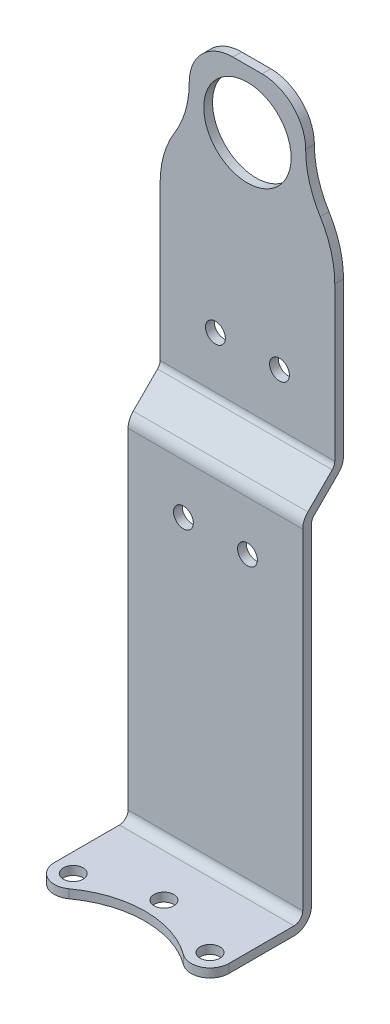
ISO-10303-21;
HEADER;
FILE_DESCRIPTION(('STEP AP214'),'2;1');
FILE_NAME('part.step','',(''),(''),'','','');
FILE_SCHEMA(('AUTOMOTIVE_DESIGN { 1 0 10303 214 1 1 1 1 }'));
ENDSEC;
DATA;
#1=APPLICATION_CONTEXT('core data for automotive mechanical design processes');
#2=APPLICATION_PROTOCOL_DEFINITION('international standard','automotive_design',2000,#1);
#3=PRODUCT_CONTEXT('',#1,'mechanical');
#4=PRODUCT('Part','Part','',(#3));
#5=PRODUCT_RELATED_PRODUCT_CATEGORY('part','',(#4));
#6=PRODUCT_DEFINITION_FORMATION('','',#4);
#7=PRODUCT_DEFINITION_CONTEXT('part definition',#1,'design');
#8=PRODUCT_DEFINITION('design','',#6,#7);
#9=PRODUCT_DEFINITION_SHAPE('','',#8);
#10=(LENGTH_UNIT() NAMED_UNIT(*) SI_UNIT(.MILLI.,.METRE.));
#11=(NAMED_UNIT(*) PLANE_ANGLE_UNIT() SI_UNIT($,.RADIAN.));
#12=(NAMED_UNIT(*) SI_UNIT($,.STERADIAN.) SOLID_ANGLE_UNIT());
#13=UNCERTAINTY_MEASURE_WITH_UNIT(LENGTH_MEASURE(1.E-05),#10,'distance_accuracy_value','');
#14=(GEOMETRIC_REPRESENTATION_CONTEXT(3) GLOBAL_UNCERTAINTY_ASSIGNED_CONTEXT((#13)) GLOBAL_UNIT_ASSIGNED_CONTEXT((#10,
#11,#12)) REPRESENTATION_CONTEXT('',''));
#15=CARTESIAN_POINT('',(0.,0.,0.));
#16=DIRECTION('',(0.,0.,1.));
#17=DIRECTION('',(1.,0.,0.));
#18=AXIS2_PLACEMENT_3D('',#15,#16,#17);
#19=CARTESIAN_POINT('',(-15.,-33.4999999999987,-4.));
#20=DIRECTION('',(-1.,0.,0.));
#21=DIRECTION('',(0.,0.,1.));
#22=AXIS2_PLACEMENT_3D('',#19,#20,#21);
#23=PLANE('',#22);
#24=DIRECTION('',(0.,1.,0.));
#25=VECTOR('',#24,1.);
#26=CARTESIAN_POINT('',(-15.,-33.4999999999987,-4.));
#27=LINE('',#26,#25);
#28=CARTESIAN_POINT('',(-15.,33.621320343561,-4.));
#29=VERTEX_POINT('',#28);
#30=CARTESIAN_POINT('',(-15.0000000000001,60.0000000000013,-4.));
#31=VERTEX_POINT('',#30);
#32=EDGE_CURVE('E315',#29,#31,#27,.T.);
#33=ORIENTED_EDGE('',*,*,#32,.F.);
#34=CARTESIAN_POINT('',(-15.,33.621320343561,-1.));
#35=DIRECTION('',(-1.,0.,0.));
#36=DIRECTION('',(0.,0.,1.));
#37=AXIS2_PLACEMENT_3D('',#34,#35,#36);
#38=CIRCLE('',#37,3.);
#39=CARTESIAN_POINT('',(-15.,31.5000000000013,-3.12132034355966));
#40=VERTEX_POINT('',#39);
#41=EDGE_CURVE('E414',#29,#40,#38,.T.);
#42=ORIENTED_EDGE('',*,*,#41,.T.);
#43=DIRECTION('',(0.,0.707106781186551,-0.707106781186544));
#44=VECTOR('',#43,1.);
#45=CARTESIAN_POINT('',(-15.,26.8786796564416,1.5));
#46=LINE('',#45,#44);
#47=CARTESIAN_POINT('',(-15.,27.3180194846618,1.06066017177983));
#48=VERTEX_POINT('',#47);
#49=EDGE_CURVE('E478',#48,#40,#46,.T.);
#50=ORIENTED_EDGE('',*,*,#49,.F.);
#51=CARTESIAN_POINT('',(-15.,26.257359312882,0.));
#52=DIRECTION('',(-1.,0.,0.));
#53=DIRECTION('',(0.,0.,1.));
#54=AXIS2_PLACEMENT_3D('',#51,#52,#53);
#55=CIRCLE('',#54,1.5);
#56=CARTESIAN_POINT('',(-15.,26.257359312882,1.5));
#57=VERTEX_POINT('',#56);
#58=EDGE_CURVE('E397',#48,#57,#55,.F.);
#59=ORIENTED_EDGE('',*,*,#58,.T.);
#60=DIRECTION('',(0.,1.,0.));
#61=VECTOR('',#60,1.);
#62=CARTESIAN_POINT('',(-15.,-33.4999999999987,1.5));
#63=LINE('',#62,#61);
#64=CARTESIAN_POINT('',(-15.,-30.4999999999987,1.5));
#65=VERTEX_POINT('',#64);
#66=EDGE_CURVE('E356',#65,#57,#63,.T.);
#67=ORIENTED_EDGE('',*,*,#66,.F.);
#68=CARTESIAN_POINT('',(-15.,-30.4999999999987,4.5));
#69=DIRECTION('',(-1.,0.,0.));
#70=DIRECTION('',(0.,0.,1.));
#71=AXIS2_PLACEMENT_3D('',#68,#69,#70);
#72=CIRCLE('',#71,3.);
#73=CARTESIAN_POINT('',(-15.,-33.4999999999987,4.5));
#74=VERTEX_POINT('',#73);
#75=EDGE_CURVE('E408',#65,#74,#72,.T.);
#76=ORIENTED_EDGE('',*,*,#75,.T.);
#77=DIRECTION('',(0.,0.,1.));
#78=VECTOR('',#77,1.);
#79=CARTESIAN_POINT('',(-15.,-33.4999999999987,-4.));
#80=LINE('',#79,#78);
#81=CARTESIAN_POINT('',(-15.,-33.4999999999987,15.6773451317715));
#82=VERTEX_POINT('',#81);
#83=EDGE_CURVE('E296',#74,#82,#80,.T.);
#84=ORIENTED_EDGE('',*,*,#83,.T.);
#85=DIRECTION('',(0.,1.,0.));
#86=VECTOR('',#85,1.);
#87=CARTESIAN_POINT('',(-15.,-33.4999999999987,15.6773451317715));
#88=LINE('',#87,#86);
#89=CARTESIAN_POINT('',(-15.,-31.9999999999987,15.6773451317715));
#90=VERTEX_POINT('',#89);
#91=EDGE_CURVE('E346',#82,#90,#88,.T.);
#92=ORIENTED_EDGE('',*,*,#91,.T.);
#93=DIRECTION('',(0.,0.,1.));
#94=VECTOR('',#93,1.);
#95=CARTESIAN_POINT('',(-15.,-31.9999999999987,-4.));
#96=LINE('',#95,#94);
#97=CARTESIAN_POINT('',(-15.,-31.9999999999987,4.5));
#98=VERTEX_POINT('',#97);
#99=EDGE_CURVE('E295',#98,#90,#96,.T.);
#100=ORIENTED_EDGE('',*,*,#99,.F.);
#101=CARTESIAN_POINT('',(-15.,-30.4999999999987,4.5));
#102=DIRECTION('',(-1.,0.,0.));
#103=DIRECTION('',(0.,0.,1.));
#104=AXIS2_PLACEMENT_3D('',#101,#102,#103);
#105=CIRCLE('',#104,1.5);
#106=CARTESIAN_POINT('',(-15.,-30.4999999999987,3.));
#107=VERTEX_POINT('',#106);
#108=EDGE_CURVE('E387',#98,#107,#105,.F.);
#109=ORIENTED_EDGE('',*,*,#108,.T.);
#110=DIRECTION('',(0.,-1.,0.));
#111=VECTOR('',#110,1.);
#112=CARTESIAN_POINT('',(-15.,85.0000000000013,3.));
#113=LINE('',#112,#111);
#114=CARTESIAN_POINT('',(-15.,26.257359312882,3.));
#115=VERTEX_POINT('',#114);
#116=EDGE_CURVE('E289',#115,#107,#113,.T.);
#117=ORIENTED_EDGE('',*,*,#116,.F.);
#118=CARTESIAN_POINT('',(-15.,26.257359312882,0.));
#119=DIRECTION('',(-1.,0.,0.));
#120=DIRECTION('',(0.,0.,1.));
#121=AXIS2_PLACEMENT_3D('',#118,#119,#120);
#122=CIRCLE('',#121,3.);
#123=CARTESIAN_POINT('',(-15.,28.3786796564416,2.12132034355965));
#124=VERTEX_POINT('',#123);
#125=EDGE_CURVE('E411',#115,#124,#122,.T.);
#126=ORIENTED_EDGE('',*,*,#125,.T.);
#127=DIRECTION('',(0.,-0.707106781186551,0.707106781186544));
#128=VECTOR('',#127,1.);
#129=CARTESIAN_POINT('',(-15.,33.0000000000013,-2.49999999999996));
#130=LINE('',#129,#128);
#131=CARTESIAN_POINT('',(-15.,32.5606601717811,-2.06066017177979));
#132=VERTEX_POINT('',#131);
#133=EDGE_CURVE('E272',#132,#124,#130,.T.);
#134=ORIENTED_EDGE('',*,*,#133,.F.);
#135=CARTESIAN_POINT('',(-15.,33.6213203435609,-0.999999999999963));
#136=DIRECTION('',(-1.,0.,0.));
#137=DIRECTION('',(0.,0.,1.));
#138=AXIS2_PLACEMENT_3D('',#135,#136,#137);
#139=CIRCLE('',#138,1.5);
#140=CARTESIAN_POINT('',(-15.,33.6213203435609,-2.49999999999996));
#141=VERTEX_POINT('',#140);
#142=EDGE_CURVE('E391',#132,#141,#139,.F.);
#143=ORIENTED_EDGE('',*,*,#142,.T.);
#144=DIRECTION('',(0.,-1.,0.));
#145=VECTOR('',#144,1.);
#146=CARTESIAN_POINT('',(-15.,85.0000000000013,-2.49999999999996));
#147=LINE('',#146,#145);
#148=CARTESIAN_POINT('',(-15.0000000000001,60.0000000000013,-2.49999999999996));
#149=VERTEX_POINT('',#148);
#150=EDGE_CURVE('E263',#149,#141,#147,.T.);
#151=ORIENTED_EDGE('',*,*,#150,.F.);
#152=DIRECTION('',(0.,0.,1.));
#153=VECTOR('',#152,1.);
#154=CARTESIAN_POINT('',(-15.0000000000001,60.0000000000013,-4.));
#155=LINE('',#154,#153);
#156=EDGE_CURVE('E260',#31,#149,#155,.T.);
#157=ORIENTED_EDGE('',*,*,#156,.F.);
#158=EDGE_LOOP('',(#33,#42,#50,#59,#67,#76,#84,#92,#100,#109,#117,#126,#134,#143,#151,#157));
#159=FACE_BOUND('',#158,.T.);
#160=ADVANCED_FACE('F45',(#159),#23,.T.);
#161=CARTESIAN_POINT('',(15.,-33.4999999999987,-4.));
#162=DIRECTION('',(0.,0.,-1.));
#163=DIRECTION('',(-1.,0.,0.));
#164=AXIS2_PLACEMENT_3D('',#161,#162,#163);
#165=PLANE('',#164);
#166=CARTESIAN_POINT('',(0.,75.,-4.));
#167=DIRECTION('',(0.,0.,1.));
#168=DIRECTION('',(1.,0.,0.));
#169=AXIS2_PLACEMENT_3D('',#166,#167,#168);
#170=CIRCLE('',#169,7.49999999999999);
#171=CARTESIAN_POINT('',(7.49999999999999,75.,-4.));
#172=VERTEX_POINT('',#171);
#173=EDGE_CURVE('E471',#172,#172,#170,.T.);
#174=ORIENTED_EDGE('',*,*,#173,.T.);
#175=EDGE_LOOP('',(#174));
#176=FACE_BOUND('',#175,.T.);
#177=CARTESIAN_POINT('',(-5.5,42.4999999999992,-4.));
#178=DIRECTION('',(0.,0.,1.));
#179=DIRECTION('',(1.,0.,0.));
#180=AXIS2_PLACEMENT_3D('',#177,#178,#179);
#181=CIRCLE('',#180,1.70000000000009);
#182=CARTESIAN_POINT('',(-3.79999999999991,42.4999999999992,-4.));
#183=VERTEX_POINT('',#182);
#184=EDGE_CURVE('E486',#183,#183,#181,.T.);
#185=ORIENTED_EDGE('',*,*,#184,.T.);
#186=EDGE_LOOP('',(#185));
#187=FACE_BOUND('',#186,.T.);
#188=CARTESIAN_POINT('',(5.5,42.4999999999992,-4.));
#189=DIRECTION('',(0.,0.,1.));
#190=DIRECTION('',(1.,0.,0.));
#191=AXIS2_PLACEMENT_3D('',#188,#189,#190);
#192=CIRCLE('',#191,1.70000000000009);
#193=CARTESIAN_POINT('',(7.20000000000009,42.4999999999992,-4.));
#194=VERTEX_POINT('',#193);
#195=EDGE_CURVE('E481',#194,#194,#192,.T.);
#196=ORIENTED_EDGE('',*,*,#195,.T.);
#197=EDGE_LOOP('',(#196));
#198=FACE_BOUND('',#197,.T.);
#199=DIRECTION('',(-1.,0.,0.));
#200=VECTOR('',#199,1.);
#201=CARTESIAN_POINT('',(-15.,85.0000000000013,-4.));
#202=LINE('',#201,#200);
#203=CARTESIAN_POINT('',(2.5,85.0000000000013,-4.));
#204=VERTEX_POINT('',#203);
#205=CARTESIAN_POINT('',(-2.5,85.0000000000013,-4.));
#206=VERTEX_POINT('',#205);
#207=EDGE_CURVE('E286',#204,#206,#202,.T.);
#208=ORIENTED_EDGE('',*,*,#207,.F.);
#209=CARTESIAN_POINT('',(2.5,77.5000000000013,-4.));
#210=DIRECTION('',(0.,0.,-1.));
#211=DIRECTION('',(-1.,0.,0.));
#212=AXIS2_PLACEMENT_3D('',#209,#210,#211);
#213=CIRCLE('',#212,7.5);
#214=CARTESIAN_POINT('',(10.,77.5000000000013,-4.));
#215=VERTEX_POINT('',#214);
#216=EDGE_CURVE('E54',#204,#215,#213,.T.);
#217=ORIENTED_EDGE('',*,*,#216,.T.);
#218=CARTESIAN_POINT('',(26.5625,77.5000000000013,-4.));
#219=DIRECTION('',(0.,0.,1.));
#220=DIRECTION('',(1.,0.,0.));
#221=AXIS2_PLACEMENT_3D('',#218,#219,#220);
#222=CIRCLE('',#221,16.5625);
#223=CARTESIAN_POINT('',(12.5,68.7500000000013,-4.));
#224=VERTEX_POINT('',#223);
#225=EDGE_CURVE('E207',#215,#224,#222,.T.);
#226=ORIENTED_EDGE('',*,*,#225,.T.);
#227=CARTESIAN_POINT('',(-1.56250000000004,60.0000000000013,-4.));
#228=DIRECTION('',(0.,0.,-1.));
#229=DIRECTION('',(-1.,0.,0.));
#230=AXIS2_PLACEMENT_3D('',#227,#228,#229);
#231=CIRCLE('',#230,16.5624999999997);
#232=CARTESIAN_POINT('',(14.9999999999997,60.0000000000013,-4.));
#233=VERTEX_POINT('',#232);
#234=EDGE_CURVE('E212',#224,#233,#231,.T.);
#235=ORIENTED_EDGE('',*,*,#234,.T.);
#236=DIRECTION('',(0.,1.,0.));
#237=VECTOR('',#236,1.);
#238=CARTESIAN_POINT('',(15.,-33.4999999999987,-4.));
#239=LINE('',#238,#237);
#240=CARTESIAN_POINT('',(15.,33.621320343561,-4.));
#241=VERTEX_POINT('',#240);
#242=EDGE_CURVE('E333',#241,#233,#239,.T.);
#243=ORIENTED_EDGE('',*,*,#242,.F.);
#244=DIRECTION('',(-1.,0.,0.));
#245=VECTOR('',#244,1.);
#246=CARTESIAN_POINT('',(-15.,33.621320343561,-4.));
#247=LINE('',#246,#245);
#248=EDGE_CURVE('E404',#241,#29,#247,.T.);
#249=ORIENTED_EDGE('',*,*,#248,.T.);
#250=ORIENTED_EDGE('',*,*,#32,.T.);
#251=CARTESIAN_POINT('',(1.56250000000004,60.0000000000013,-4.));
#252=DIRECTION('',(0.,0.,-1.));
#253=DIRECTION('',(-1.,0.,0.));
#254=AXIS2_PLACEMENT_3D('',#251,#252,#253);
#255=CIRCLE('',#254,16.5625000000001);
#256=CARTESIAN_POINT('',(-12.5,68.7500000000013,-4.));
#257=VERTEX_POINT('',#256);
#258=EDGE_CURVE('E247',#31,#257,#255,.T.);
#259=ORIENTED_EDGE('',*,*,#258,.T.);
#260=CARTESIAN_POINT('',(-26.5625,77.5000000000013,-4.));
#261=DIRECTION('',(0.,0.,1.));
#262=DIRECTION('',(1.,0.,0.));
#263=AXIS2_PLACEMENT_3D('',#260,#261,#262);
#264=CIRCLE('',#263,16.5625);
#265=CARTESIAN_POINT('',(-10.,77.5000000000013,-4.));
#266=VERTEX_POINT('',#265);
#267=EDGE_CURVE('E251',#257,#266,#264,.T.);
#268=ORIENTED_EDGE('',*,*,#267,.T.);
#269=CARTESIAN_POINT('',(-2.5,77.5000000000013,-4.));
#270=DIRECTION('',(0.,0.,-1.));
#271=DIRECTION('',(-1.,0.,0.));
#272=AXIS2_PLACEMENT_3D('',#269,#270,#271);
#273=CIRCLE('',#272,7.5);
#274=EDGE_CURVE('E66',#266,#206,#273,.T.);
#275=ORIENTED_EDGE('',*,*,#274,.T.);
#276=EDGE_LOOP('',(#208,#217,#226,#235,#243,#249,#250,#259,#268,#275));
#277=FACE_BOUND('',#276,.T.);
#278=ADVANCED_FACE('F209',(#176,#187,#198,#277),#165,.T.);
#279=CARTESIAN_POINT('',(15.,-33.4999999999987,15.6773451317716));
#280=DIRECTION('',(1.,0.,0.));
#281=DIRECTION('',(0.,0.,-1.));
#282=AXIS2_PLACEMENT_3D('',#279,#280,#281);
#283=PLANE('',#282);
#284=DIRECTION('',(0.,0.707106781186551,-0.707106781186544));
#285=VECTOR('',#284,1.);
#286=CARTESIAN_POINT('',(15.,26.8786796564416,1.5));
#287=LINE('',#286,#285);
#288=CARTESIAN_POINT('',(15.,27.3180194846618,1.06066017177983));
#289=VERTEX_POINT('',#288);
#290=CARTESIAN_POINT('',(15.,31.5000000000013,-3.12132034355966));
#291=VERTEX_POINT('',#290);
#292=EDGE_CURVE('E241',#289,#291,#287,.T.);
#293=ORIENTED_EDGE('',*,*,#292,.T.);
#294=CARTESIAN_POINT('',(15.,33.621320343561,-1.));
#295=DIRECTION('',(1.,0.,0.));
#296=DIRECTION('',(0.,0.,-1.));
#297=AXIS2_PLACEMENT_3D('',#294,#295,#296);
#298=CIRCLE('',#297,3.);
#299=EDGE_CURVE('E426',#291,#241,#298,.T.);
#300=ORIENTED_EDGE('',*,*,#299,.T.);
#301=ORIENTED_EDGE('',*,*,#242,.T.);
#302=DIRECTION('',(0.,0.,1.));
#303=VECTOR('',#302,1.);
#304=CARTESIAN_POINT('',(14.9999999999997,60.0000000000013,-4.));
#305=LINE('',#304,#303);
#306=CARTESIAN_POINT('',(14.9999999999997,60.0000000000013,-2.49999999999996));
#307=VERTEX_POINT('',#306);
#308=EDGE_CURVE('E228',#233,#307,#305,.T.);
#309=ORIENTED_EDGE('',*,*,#308,.T.);
#310=DIRECTION('',(0.,-1.,0.));
#311=VECTOR('',#310,1.);
#312=CARTESIAN_POINT('',(15.,85.0000000000013,-2.49999999999996));
#313=LINE('',#312,#311);
#314=CARTESIAN_POINT('',(15.,33.6213203435609,-2.49999999999996));
#315=VERTEX_POINT('',#314);
#316=EDGE_CURVE('E267',#307,#315,#313,.T.);
#317=ORIENTED_EDGE('',*,*,#316,.T.);
#318=CARTESIAN_POINT('',(15.,33.6213203435609,-0.999999999999963));
#319=DIRECTION('',(1.,0.,0.));
#320=DIRECTION('',(0.,0.,-1.));
#321=AXIS2_PLACEMENT_3D('',#318,#319,#320);
#322=CIRCLE('',#321,1.5);
#323=CARTESIAN_POINT('',(15.,32.5606601717811,-2.06066017177979));
#324=VERTEX_POINT('',#323);
#325=EDGE_CURVE('E394',#315,#324,#322,.F.);
#326=ORIENTED_EDGE('',*,*,#325,.T.);
#327=DIRECTION('',(0.,-0.707106781186551,0.707106781186544));
#328=VECTOR('',#327,1.);
#329=CARTESIAN_POINT('',(15.,33.0000000000013,-2.49999999999996));
#330=LINE('',#329,#328);
#331=CARTESIAN_POINT('',(15.,28.3786796564416,2.12132034355965));
#332=VERTEX_POINT('',#331);
#333=EDGE_CURVE('E271',#324,#332,#330,.T.);
#334=ORIENTED_EDGE('',*,*,#333,.T.);
#335=CARTESIAN_POINT('',(15.,26.257359312882,0.));
#336=DIRECTION('',(1.,0.,0.));
#337=DIRECTION('',(0.,0.,-1.));
#338=AXIS2_PLACEMENT_3D('',#335,#336,#337);
#339=CIRCLE('',#338,3.);
#340=CARTESIAN_POINT('',(15.,26.257359312882,3.));
#341=VERTEX_POINT('',#340);
#342=EDGE_CURVE('E423',#332,#341,#339,.T.);
#343=ORIENTED_EDGE('',*,*,#342,.T.);
#344=DIRECTION('',(0.,-1.,0.));
#345=VECTOR('',#344,1.);
#346=CARTESIAN_POINT('',(15.,85.0000000000013,3.));
#347=LINE('',#346,#345);
#348=CARTESIAN_POINT('',(15.,-30.4999999999987,3.));
#349=VERTEX_POINT('',#348);
#350=EDGE_CURVE('E292',#341,#349,#347,.T.);
#351=ORIENTED_EDGE('',*,*,#350,.T.);
#352=CARTESIAN_POINT('',(15.,-30.4999999999987,4.5));
#353=DIRECTION('',(1.,0.,0.));
#354=DIRECTION('',(0.,0.,-1.));
#355=AXIS2_PLACEMENT_3D('',#352,#353,#354);
#356=CIRCLE('',#355,1.5);
#357=CARTESIAN_POINT('',(15.,-31.9999999999987,4.5));
#358=VERTEX_POINT('',#357);
#359=EDGE_CURVE('E384',#349,#358,#356,.F.);
#360=ORIENTED_EDGE('',*,*,#359,.T.);
#361=DIRECTION('',(0.,0.,-1.));
#362=VECTOR('',#361,1.);
#363=CARTESIAN_POINT('',(15.,-31.9999999999987,15.6773451317716));
#364=LINE('',#363,#362);
#365=CARTESIAN_POINT('',(15.,-31.9999999999987,15.6773451317716));
#366=VERTEX_POINT('',#365);
#367=EDGE_CURVE('E300',#366,#358,#364,.T.);
#368=ORIENTED_EDGE('',*,*,#367,.F.);
#369=DIRECTION('',(0.,1.,0.));
#370=VECTOR('',#369,1.);
#371=CARTESIAN_POINT('',(15.,-33.4999999999987,15.6773451317716));
#372=LINE('',#371,#370);
#373=CARTESIAN_POINT('',(15.,-33.4999999999987,15.6773451317716));
#374=VERTEX_POINT('',#373);
#375=EDGE_CURVE('E337',#374,#366,#372,.T.);
#376=ORIENTED_EDGE('',*,*,#375,.F.);
#377=DIRECTION('',(0.,0.,-1.));
#378=VECTOR('',#377,1.);
#379=CARTESIAN_POINT('',(15.,-33.4999999999987,15.6773451317716));
#380=LINE('',#379,#378);
#381=CARTESIAN_POINT('',(15.,-33.4999999999987,4.5));
#382=VERTEX_POINT('',#381);
#383=EDGE_CURVE('E311',#374,#382,#380,.T.);
#384=ORIENTED_EDGE('',*,*,#383,.T.);
#385=CARTESIAN_POINT('',(15.,-30.4999999999987,4.5));
#386=DIRECTION('',(1.,0.,0.));
#387=DIRECTION('',(0.,0.,-1.));
#388=AXIS2_PLACEMENT_3D('',#385,#386,#387);
#389=CIRCLE('',#388,3.);
#390=CARTESIAN_POINT('',(15.,-30.4999999999987,1.5));
#391=VERTEX_POINT('',#390);
#392=EDGE_CURVE('E420',#382,#391,#389,.T.);
#393=ORIENTED_EDGE('',*,*,#392,.T.);
#394=DIRECTION('',(0.,1.,0.));
#395=VECTOR('',#394,1.);
#396=CARTESIAN_POINT('',(15.,-33.4999999999987,1.5));
#397=LINE('',#396,#395);
#398=CARTESIAN_POINT('',(15.,26.257359312882,1.5));
#399=VERTEX_POINT('',#398);
#400=EDGE_CURVE('E494',#391,#399,#397,.T.);
#401=ORIENTED_EDGE('',*,*,#400,.T.);
#402=CARTESIAN_POINT('',(15.,26.257359312882,0.));
#403=DIRECTION('',(1.,0.,0.));
#404=DIRECTION('',(0.,0.,-1.));
#405=AXIS2_PLACEMENT_3D('',#402,#403,#404);
#406=CIRCLE('',#405,1.5);
#407=EDGE_CURVE('E401',#399,#289,#406,.F.);
#408=ORIENTED_EDGE('',*,*,#407,.T.);
#409=EDGE_LOOP('',(#293,#300,#301,#309,#317,#326,#334,#343,#351,#360,#368,#376,#384,#393,#401,#408));
#410=FACE_BOUND('',#409,.T.);
#411=ADVANCED_FACE('F576',(#410),#283,.T.);
#412=CARTESIAN_POINT('',(11.75,-33.4999999999987,15.6773451317714));
#413=DIRECTION('',(0.,1.,0.));
#414=DIRECTION('',(0.,0.,1.));
#415=AXIS2_PLACEMENT_3D('',#412,#413,#414);
#416=CYLINDRICAL_SURFACE('',#415,3.25000000000001);
#417=CARTESIAN_POINT('',(11.75,-31.9999999999987,15.6773451317714));
#418=DIRECTION('',(0.,1.,0.));
#419=DIRECTION('',(0.,0.,1.));
#420=AXIS2_PLACEMENT_3D('',#417,#418,#419);
#421=CIRCLE('',#420,3.25000000000001);
#422=CARTESIAN_POINT('',(9.83583959899751,-31.9999999999987,18.3038427920091));
#423=VERTEX_POINT('',#422);
#424=EDGE_CURVE('E326',#423,#366,#421,.T.);
#425=ORIENTED_EDGE('',*,*,#424,.F.);
#426=DIRECTION('',(0.,1.,0.));
#427=VECTOR('',#426,1.);
#428=CARTESIAN_POINT('',(9.83583959899751,-33.4999999999987,18.3038427920091));
#429=LINE('',#428,#427);
#430=CARTESIAN_POINT('',(9.83583959899751,-33.4999999999987,18.3038427920091));
#431=VERTEX_POINT('',#430);
#432=EDGE_CURVE('E340',#431,#423,#429,.T.);
#433=ORIENTED_EDGE('',*,*,#432,.F.);
#434=CARTESIAN_POINT('',(11.75,-33.4999999999987,15.6773451317714));
#435=DIRECTION('',(0.,1.,0.));
#436=DIRECTION('',(0.,0.,1.));
#437=AXIS2_PLACEMENT_3D('',#434,#435,#436);
#438=CIRCLE('',#437,3.25000000000001);
#439=EDGE_CURVE('E307',#431,#374,#438,.T.);
#440=ORIENTED_EDGE('',*,*,#439,.T.);
#441=ORIENTED_EDGE('',*,*,#375,.T.);
#442=EDGE_LOOP('',(#425,#433,#440,#441));
#443=FACE_BOUND('',#442,.T.);
#444=ADVANCED_FACE('F574',(#443),#416,.T.);
#445=CARTESIAN_POINT('',(0.,-33.4999999999987,31.7999999999996));
#446=DIRECTION('',(0.,1.,0.));
#447=DIRECTION('',(0.,0.,1.));
#448=AXIS2_PLACEMENT_3D('',#445,#446,#447);
#449=CYLINDRICAL_SURFACE('',#448,16.7);
#450=CARTESIAN_POINT('',(0.,-31.9999999999987,31.7999999999996));
#451=DIRECTION('',(0.,-1.,0.));
#452=DIRECTION('',(0.,0.,-1.));
#453=AXIS2_PLACEMENT_3D('',#450,#451,#452);
#454=CIRCLE('',#453,16.7);
#455=CARTESIAN_POINT('',(-9.8358395989975,-31.9999999999987,18.3038427920092));
#456=VERTEX_POINT('',#455);
#457=EDGE_CURVE('E322',#456,#423,#454,.T.);
#458=ORIENTED_EDGE('',*,*,#457,.F.);
#459=DIRECTION('',(0.,1.,0.));
#460=VECTOR('',#459,1.);
#461=CARTESIAN_POINT('',(-9.8358395989975,-33.4999999999987,18.3038427920092));
#462=LINE('',#461,#460);
#463=CARTESIAN_POINT('',(-9.8358395989975,-33.4999999999987,18.3038427920092));
#464=VERTEX_POINT('',#463);
#465=EDGE_CURVE('E343',#464,#456,#462,.T.);
#466=ORIENTED_EDGE('',*,*,#465,.F.);
#467=CARTESIAN_POINT('',(0.,-33.4999999999987,31.7999999999996));
#468=DIRECTION('',(0.,-1.,0.));
#469=DIRECTION('',(0.,0.,-1.));
#470=AXIS2_PLACEMENT_3D('',#467,#468,#469);
#471=CIRCLE('',#470,16.7);
#472=EDGE_CURVE('E303',#464,#431,#471,.T.);
#473=ORIENTED_EDGE('',*,*,#472,.T.);
#474=ORIENTED_EDGE('',*,*,#432,.T.);
#475=EDGE_LOOP('',(#458,#466,#473,#474));
#476=FACE_BOUND('',#475,.T.);
#477=ADVANCED_FACE('F571',(#476),#449,.F.);
#478=CARTESIAN_POINT('',(-11.75,-33.4999999999987,15.6773451317715));
#479=DIRECTION('',(0.,1.,0.));
#480=DIRECTION('',(0.,0.,1.));
#481=AXIS2_PLACEMENT_3D('',#478,#479,#480);
#482=CYLINDRICAL_SURFACE('',#481,3.24999999999999);
#483=CARTESIAN_POINT('',(-11.75,-31.9999999999987,15.6773451317715));
#484=DIRECTION('',(0.,1.,0.));
#485=DIRECTION('',(0.,0.,1.));
#486=AXIS2_PLACEMENT_3D('',#483,#484,#485);
#487=CIRCLE('',#486,3.24999999999999);
#488=EDGE_CURVE('E318',#90,#456,#487,.T.);
#489=ORIENTED_EDGE('',*,*,#488,.F.);
#490=ORIENTED_EDGE('',*,*,#91,.F.);
#491=CARTESIAN_POINT('',(-11.75,-33.4999999999987,15.6773451317715));
#492=DIRECTION('',(0.,1.,0.));
#493=DIRECTION('',(0.,0.,1.));
#494=AXIS2_PLACEMENT_3D('',#491,#492,#493);
#495=CIRCLE('',#494,3.24999999999999);
#496=EDGE_CURVE('E299',#82,#464,#495,.T.);
#497=ORIENTED_EDGE('',*,*,#496,.T.);
#498=ORIENTED_EDGE('',*,*,#465,.T.);
#499=EDGE_LOOP('',(#489,#490,#497,#498));
#500=FACE_BOUND('',#499,.T.);
#501=ADVANCED_FACE('F567',(#500),#482,.T.);
#502=CARTESIAN_POINT('',(-11.75,-33.4999999999987,15.6773451317715));
#503=DIRECTION('',(0.,1.,0.));
#504=DIRECTION('',(0.,0.,1.));
#505=AXIS2_PLACEMENT_3D('',#502,#503,#504);
#506=PLANE('',#505);
#507=CARTESIAN_POINT('',(-11.75,-33.4999999999987,15.6773451317715));
#508=DIRECTION('',(0.,1.,0.));
#509=DIRECTION('',(0.,0.,1.));
#510=AXIS2_PLACEMENT_3D('',#507,#508,#509);
#511=CIRCLE('',#510,1.69999999999997);
#512=CARTESIAN_POINT('',(-11.75,-33.4999999999987,17.3773451317714));
#513=VERTEX_POINT('',#512);
#514=EDGE_CURVE('E475',#513,#513,#511,.T.);
#515=ORIENTED_EDGE('',*,*,#514,.T.);
#516=EDGE_LOOP('',(#515));
#517=FACE_BOUND('',#516,.T.);
#518=CARTESIAN_POINT('',(0.,-33.4999999999987,11.8499999999996));
#519=DIRECTION('',(0.,1.,0.));
#520=DIRECTION('',(0.,0.,1.));
#521=AXIS2_PLACEMENT_3D('',#518,#519,#520);
#522=CIRCLE('',#521,1.69999999999997);
#523=CARTESIAN_POINT('',(0.,-33.4999999999987,13.5499999999996));
#524=VERTEX_POINT('',#523);
#525=EDGE_CURVE('E465',#524,#524,#522,.T.);
#526=ORIENTED_EDGE('',*,*,#525,.T.);
#527=EDGE_LOOP('',(#526));
#528=FACE_BOUND('',#527,.T.);
#529=CARTESIAN_POINT('',(11.75,-33.4999999999987,15.6773451317715));
#530=DIRECTION('',(0.,1.,0.));
#531=DIRECTION('',(0.,0.,1.));
#532=AXIS2_PLACEMENT_3D('',#529,#530,#531);
#533=CIRCLE('',#532,1.69999999999997);
#534=CARTESIAN_POINT('',(11.75,-33.4999999999987,17.3773451317714));
#535=VERTEX_POINT('',#534);
#536=EDGE_CURVE('E464',#535,#535,#533,.T.);
#537=ORIENTED_EDGE('',*,*,#536,.T.);
#538=EDGE_LOOP('',(#537));
#539=FACE_BOUND('',#538,.T.);
#540=ORIENTED_EDGE('',*,*,#83,.F.);
#541=DIRECTION('',(-1.,0.,0.));
#542=VECTOR('',#541,1.);
#543=CARTESIAN_POINT('',(-11.75,-33.4999999999987,4.5));
#544=LINE('',#543,#542);
#545=EDGE_CURVE('E439',#74,#382,#544,.F.);
#546=ORIENTED_EDGE('',*,*,#545,.T.);
#547=ORIENTED_EDGE('',*,*,#383,.F.);
#548=ORIENTED_EDGE('',*,*,#439,.F.);
#549=ORIENTED_EDGE('',*,*,#472,.F.);
#550=ORIENTED_EDGE('',*,*,#496,.F.);
#551=EDGE_LOOP('',(#540,#546,#547,#548,#549,#550));
#552=FACE_BOUND('',#551,.T.);
#553=ADVANCED_FACE('F530',(#517,#528,#539,#552),#506,.F.);
#554=CARTESIAN_POINT('',(-11.75,-31.9999999999987,15.6773451317715));
#555=DIRECTION('',(0.,1.,0.));
#556=DIRECTION('',(0.,0.,1.));
#557=AXIS2_PLACEMENT_3D('',#554,#555,#556);
#558=PLANE('',#557);
#559=CARTESIAN_POINT('',(-11.75,-31.9999999999987,15.6773451317715));
#560=DIRECTION('',(0.,1.,0.));
#561=DIRECTION('',(0.,0.,1.));
#562=AXIS2_PLACEMENT_3D('',#559,#560,#561);
#563=CIRCLE('',#562,1.69999999999997);
#564=CARTESIAN_POINT('',(-11.75,-31.9999999999987,17.3773451317714));
#565=VERTEX_POINT('',#564);
#566=EDGE_CURVE('E473',#565,#565,#563,.T.);
#567=ORIENTED_EDGE('',*,*,#566,.F.);
#568=EDGE_LOOP('',(#567));
#569=FACE_BOUND('',#568,.T.);
#570=CARTESIAN_POINT('',(0.,-31.9999999999987,11.8499999999996));
#571=DIRECTION('',(0.,1.,0.));
#572=DIRECTION('',(0.,0.,1.));
#573=AXIS2_PLACEMENT_3D('',#570,#571,#572);
#574=CIRCLE('',#573,1.69999999999997);
#575=CARTESIAN_POINT('',(0.,-31.9999999999987,13.5499999999996));
#576=VERTEX_POINT('',#575);
#577=EDGE_CURVE('E503',#576,#576,#574,.T.);
#578=ORIENTED_EDGE('',*,*,#577,.F.);
#579=EDGE_LOOP('',(#578));
#580=FACE_BOUND('',#579,.T.);
#581=CARTESIAN_POINT('',(11.75,-31.9999999999987,15.6773451317715));
#582=DIRECTION('',(0.,1.,0.));
#583=DIRECTION('',(0.,0.,1.));
#584=AXIS2_PLACEMENT_3D('',#581,#582,#583);
#585=CIRCLE('',#584,1.69999999999997);
#586=CARTESIAN_POINT('',(11.75,-31.9999999999987,17.3773451317714));
#587=VERTEX_POINT('',#586);
#588=EDGE_CURVE('E462',#587,#587,#585,.T.);
#589=ORIENTED_EDGE('',*,*,#588,.F.);
#590=EDGE_LOOP('',(#589));
#591=FACE_BOUND('',#590,.T.);
#592=ORIENTED_EDGE('',*,*,#367,.T.);
#593=DIRECTION('',(1.,0.,0.));
#594=VECTOR('',#593,1.);
#595=CARTESIAN_POINT('',(-11.75,-31.9999999999987,4.5));
#596=LINE('',#595,#594);
#597=EDGE_CURVE('E366',#358,#98,#596,.F.);
#598=ORIENTED_EDGE('',*,*,#597,.T.);
#599=ORIENTED_EDGE('',*,*,#99,.T.);
#600=ORIENTED_EDGE('',*,*,#488,.T.);
#601=ORIENTED_EDGE('',*,*,#457,.T.);
#602=ORIENTED_EDGE('',*,*,#424,.T.);
#603=EDGE_LOOP('',(#592,#598,#599,#600,#601,#602));
#604=FACE_BOUND('',#603,.T.);
#605=ADVANCED_FACE('F541',(#569,#580,#591,#604),#558,.T.);
#606=CARTESIAN_POINT('',(15.,85.0000000000013,3.));
#607=DIRECTION('',(0.,0.,-1.));
#608=DIRECTION('',(-1.,0.,0.));
#609=AXIS2_PLACEMENT_3D('',#606,#607,#608);
#610=PLANE('',#609);
#611=CARTESIAN_POINT('',(-5.5,17.757359312882,3.));
#612=DIRECTION('',(0.,0.,1.));
#613=DIRECTION('',(1.,0.,0.));
#614=AXIS2_PLACEMENT_3D('',#611,#612,#613);
#615=CIRCLE('',#614,1.69999999999999);
#616=CARTESIAN_POINT('',(-3.80000000000001,17.757359312882,3.));
#617=VERTEX_POINT('',#616);
#618=EDGE_CURVE('E362',#617,#617,#615,.T.);
#619=ORIENTED_EDGE('',*,*,#618,.F.);
#620=EDGE_LOOP('',(#619));
#621=FACE_BOUND('',#620,.T.);
#622=CARTESIAN_POINT('',(5.5,17.757359312882,3.));
#623=DIRECTION('',(0.,0.,1.));
#624=DIRECTION('',(1.,0.,0.));
#625=AXIS2_PLACEMENT_3D('',#622,#623,#624);
#626=CIRCLE('',#625,1.69999999999999);
#627=CARTESIAN_POINT('',(7.19999999999999,17.757359312882,3.));
#628=VERTEX_POINT('',#627);
#629=EDGE_CURVE('E357',#628,#628,#626,.T.);
#630=ORIENTED_EDGE('',*,*,#629,.F.);
#631=EDGE_LOOP('',(#630));
#632=FACE_BOUND('',#631,.T.);
#633=ORIENTED_EDGE('',*,*,#350,.F.);
#634=DIRECTION('',(-1.,0.,0.));
#635=VECTOR('',#634,1.);
#636=CARTESIAN_POINT('',(15.,26.257359312882,3.));
#637=LINE('',#636,#635);
#638=EDGE_CURVE('E429',#341,#115,#637,.T.);
#639=ORIENTED_EDGE('',*,*,#638,.T.);
#640=ORIENTED_EDGE('',*,*,#116,.T.);
#641=DIRECTION('',(1.,0.,0.));
#642=VECTOR('',#641,1.);
#643=CARTESIAN_POINT('',(15.,-30.4999999999987,3.));
#644=LINE('',#643,#642);
#645=EDGE_CURVE('E336',#107,#349,#644,.T.);
#646=ORIENTED_EDGE('',*,*,#645,.T.);
#647=EDGE_LOOP('',(#633,#639,#640,#646));
#648=FACE_BOUND('',#647,.T.);
#649=ADVANCED_FACE('F544',(#621,#632,#648),#610,.F.);
#650=CARTESIAN_POINT('',(0.,85.0000000000013,0.));
#651=DIRECTION('',(0.,-1.,0.));
#652=DIRECTION('',(0.,0.,-1.));
#653=AXIS2_PLACEMENT_3D('',#650,#651,#652);
#654=PLANE('',#653);
#655=DIRECTION('',(-1.,0.,0.));
#656=VECTOR('',#655,1.);
#657=CARTESIAN_POINT('',(15.,85.0000000000013,-2.49999999999996));
#658=LINE('',#657,#656);
#659=CARTESIAN_POINT('',(2.5,85.0000000000013,-2.49999999999996));
#660=VERTEX_POINT('',#659);
#661=CARTESIAN_POINT('',(-2.5,85.0000000000013,-2.49999999999996));
#662=VERTEX_POINT('',#661);
#663=EDGE_CURVE('E276',#660,#662,#658,.T.);
#664=ORIENTED_EDGE('',*,*,#663,.F.);
#665=DIRECTION('',(0.,0.,1.));
#666=VECTOR('',#665,1.);
#667=CARTESIAN_POINT('',(2.5,85.0000000000013,0.));
#668=LINE('',#667,#666);
#669=EDGE_CURVE('E455',#660,#204,#668,.F.);
#670=ORIENTED_EDGE('',*,*,#669,.T.);
#671=ORIENTED_EDGE('',*,*,#207,.T.);
#672=DIRECTION('',(0.,0.,1.));
#673=VECTOR('',#672,1.);
#674=CARTESIAN_POINT('',(-2.5,85.0000000000013,0.));
#675=LINE('',#674,#673);
#676=EDGE_CURVE('E451',#206,#662,#675,.T.);
#677=ORIENTED_EDGE('',*,*,#676,.T.);
#678=EDGE_LOOP('',(#664,#670,#671,#677));
#679=FACE_BOUND('',#678,.T.);
#680=ADVANCED_FACE('F614',(#679),#654,.F.);
#681=CARTESIAN_POINT('',(15.,33.0000000000013,-2.49999999999996));
#682=DIRECTION('',(0.,-0.707106781186544,-0.707106781186551));
#683=DIRECTION('',(0.,0.707106781186551,-0.707106781186544));
#684=AXIS2_PLACEMENT_3D('',#681,#682,#683);
#685=PLANE('',#684);
#686=ORIENTED_EDGE('',*,*,#133,.T.);
#687=DIRECTION('',(-1.,0.,0.));
#688=VECTOR('',#687,1.);
#689=CARTESIAN_POINT('',(15.,28.3786796564416,2.12132034355965));
#690=LINE('',#689,#688);
#691=EDGE_CURVE('E432',#124,#332,#690,.F.);
#692=ORIENTED_EDGE('',*,*,#691,.T.);
#693=ORIENTED_EDGE('',*,*,#333,.F.);
#694=DIRECTION('',(-1.,0.,0.));
#695=VECTOR('',#694,1.);
#696=CARTESIAN_POINT('',(-15.,32.5606601717811,-2.06066017177979));
#697=LINE('',#696,#695);
#698=EDGE_CURVE('E369',#324,#132,#697,.T.);
#699=ORIENTED_EDGE('',*,*,#698,.T.);
#700=EDGE_LOOP('',(#686,#692,#693,#699));
#701=FACE_BOUND('',#700,.T.);
#702=ADVANCED_FACE('F657',(#701),#685,.F.);
#703=CARTESIAN_POINT('',(15.,85.0000000000013,-2.49999999999996));
#704=DIRECTION('',(0.,0.,-1.));
#705=DIRECTION('',(0.,1.,0.));
#706=AXIS2_PLACEMENT_3D('',#703,#704,#705);
#707=PLANE('',#706);
#708=CARTESIAN_POINT('',(0.,75.,-2.49999999999996));
#709=DIRECTION('',(0.,0.,1.));
#710=DIRECTION('',(1.,0.,0.));
#711=AXIS2_PLACEMENT_3D('',#708,#709,#710);
#712=CIRCLE('',#711,7.49999999999999);
#713=CARTESIAN_POINT('',(7.49999999999999,75.,-2.49999999999996));
#714=VERTEX_POINT('',#713);
#715=EDGE_CURVE('E468',#714,#714,#712,.T.);
#716=ORIENTED_EDGE('',*,*,#715,.F.);
#717=EDGE_LOOP('',(#716));
#718=FACE_BOUND('',#717,.T.);
#719=CARTESIAN_POINT('',(-5.5,42.4999999999992,-2.49999999999996));
#720=DIRECTION('',(0.,0.,1.));
#721=DIRECTION('',(1.,0.,0.));
#722=AXIS2_PLACEMENT_3D('',#719,#720,#721);
#723=CIRCLE('',#722,1.70000000000009);
#724=CARTESIAN_POINT('',(-3.79999999999991,42.4999999999992,-2.49999999999996));
#725=VERTEX_POINT('',#724);
#726=EDGE_CURVE('E488',#725,#725,#723,.T.);
#727=ORIENTED_EDGE('',*,*,#726,.F.);
#728=EDGE_LOOP('',(#727));
#729=FACE_BOUND('',#728,.T.);
#730=CARTESIAN_POINT('',(5.5,42.4999999999992,-2.49999999999996));
#731=DIRECTION('',(0.,0.,1.));
#732=DIRECTION('',(1.,0.,0.));
#733=AXIS2_PLACEMENT_3D('',#730,#731,#732);
#734=CIRCLE('',#733,1.70000000000009);
#735=CARTESIAN_POINT('',(7.20000000000009,42.4999999999992,-2.49999999999996));
#736=VERTEX_POINT('',#735);
#737=EDGE_CURVE('E484',#736,#736,#734,.T.);
#738=ORIENTED_EDGE('',*,*,#737,.F.);
#739=EDGE_LOOP('',(#738));
#740=FACE_BOUND('',#739,.T.);
#741=CARTESIAN_POINT('',(26.5625,77.5000000000013,-2.49999999999996));
#742=DIRECTION('',(0.,0.,1.));
#743=DIRECTION('',(1.,0.,0.));
#744=AXIS2_PLACEMENT_3D('',#741,#742,#743);
#745=CIRCLE('',#744,16.5625);
#746=CARTESIAN_POINT('',(10.,77.5000000000013,-2.49999999999996));
#747=VERTEX_POINT('',#746);
#748=CARTESIAN_POINT('',(12.5,68.7500000000013,-2.49999999999996));
#749=VERTEX_POINT('',#748);
#750=EDGE_CURVE('E224',#747,#749,#745,.T.);
#751=ORIENTED_EDGE('',*,*,#750,.F.);
#752=CARTESIAN_POINT('',(2.5,77.5000000000013,-2.49999999999996));
#753=DIRECTION('',(0.,0.,-1.));
#754=DIRECTION('',(0.,1.,0.));
#755=AXIS2_PLACEMENT_3D('',#752,#753,#754);
#756=CIRCLE('',#755,7.5);
#757=EDGE_CURVE('E448',#747,#660,#756,.F.);
#758=ORIENTED_EDGE('',*,*,#757,.T.);
#759=ORIENTED_EDGE('',*,*,#663,.T.);
#760=CARTESIAN_POINT('',(-2.5,77.5000000000013,-2.49999999999996));
#761=DIRECTION('',(0.,0.,-1.));
#762=DIRECTION('',(0.,1.,0.));
#763=AXIS2_PLACEMENT_3D('',#760,#761,#762);
#764=CIRCLE('',#763,7.5);
#765=CARTESIAN_POINT('',(-10.,77.5000000000013,-2.49999999999996));
#766=VERTEX_POINT('',#765);
#767=EDGE_CURVE('E445',#662,#766,#764,.F.);
#768=ORIENTED_EDGE('',*,*,#767,.T.);
#769=CARTESIAN_POINT('',(-26.5625,77.5000000000013,-2.49999999999996));
#770=DIRECTION('',(0.,0.,1.));
#771=DIRECTION('',(1.,0.,0.));
#772=AXIS2_PLACEMENT_3D('',#769,#770,#771);
#773=CIRCLE('',#772,16.5625);
#774=CARTESIAN_POINT('',(-12.5,68.7500000000013,-2.49999999999996));
#775=VERTEX_POINT('',#774);
#776=EDGE_CURVE('E252',#775,#766,#773,.T.);
#777=ORIENTED_EDGE('',*,*,#776,.F.);
#778=CARTESIAN_POINT('',(1.56250000000004,60.0000000000013,-2.49999999999996));
#779=DIRECTION('',(0.,0.,-1.));
#780=DIRECTION('',(-1.,0.,0.));
#781=AXIS2_PLACEMENT_3D('',#778,#779,#780);
#782=CIRCLE('',#781,16.5625000000001);
#783=EDGE_CURVE('E245',#149,#775,#782,.T.);
#784=ORIENTED_EDGE('',*,*,#783,.F.);
#785=ORIENTED_EDGE('',*,*,#150,.T.);
#786=DIRECTION('',(-1.,0.,0.));
#787=VECTOR('',#786,1.);
#788=CARTESIAN_POINT('',(15.,33.6213203435609,-2.49999999999996));
#789=LINE('',#788,#787);
#790=EDGE_CURVE('E373',#141,#315,#789,.F.);
#791=ORIENTED_EDGE('',*,*,#790,.T.);
#792=ORIENTED_EDGE('',*,*,#316,.F.);
#793=CARTESIAN_POINT('',(-1.56250000000004,60.0000000000013,-2.49999999999996));
#794=DIRECTION('',(0.,0.,-1.));
#795=DIRECTION('',(-1.,0.,0.));
#796=AXIS2_PLACEMENT_3D('',#793,#794,#795);
#797=CIRCLE('',#796,16.5624999999997);
#798=EDGE_CURVE('E218',#749,#307,#797,.T.);
#799=ORIENTED_EDGE('',*,*,#798,.F.);
#800=EDGE_LOOP('',(#751,#758,#759,#768,#777,#784,#785,#791,#792,#799));
#801=FACE_BOUND('',#800,.T.);
#802=ADVANCED_FACE('F607',(#718,#729,#740,#801),#707,.F.);
#803=CARTESIAN_POINT('',(1.56250000000004,60.0000000000013,-4.));
#804=DIRECTION('',(0.,0.,1.));
#805=DIRECTION('',(1.,0.,0.));
#806=AXIS2_PLACEMENT_3D('',#803,#804,#805);
#807=CYLINDRICAL_SURFACE('',#806,16.5625000000001);
#808=ORIENTED_EDGE('',*,*,#783,.T.);
#809=DIRECTION('',(0.,0.,1.));
#810=VECTOR('',#809,1.);
#811=CARTESIAN_POINT('',(-12.5,68.7500000000013,-4.));
#812=LINE('',#811,#810);
#813=EDGE_CURVE('E255',#257,#775,#812,.T.);
#814=ORIENTED_EDGE('',*,*,#813,.F.);
#815=ORIENTED_EDGE('',*,*,#258,.F.);
#816=ORIENTED_EDGE('',*,*,#156,.T.);
#817=EDGE_LOOP('',(#808,#814,#815,#816));
#818=FACE_BOUND('',#817,.T.);
#819=ADVANCED_FACE('F604',(#818),#807,.T.);
#820=CARTESIAN_POINT('',(-26.5625,77.5000000000013,-4.));
#821=DIRECTION('',(0.,0.,1.));
#822=DIRECTION('',(1.,0.,0.));
#823=AXIS2_PLACEMENT_3D('',#820,#821,#822);
#824=CYLINDRICAL_SURFACE('',#823,16.5625);
#825=ORIENTED_EDGE('',*,*,#776,.T.);
#826=DIRECTION('',(0.,0.,1.));
#827=VECTOR('',#826,1.);
#828=CARTESIAN_POINT('',(-10.,77.5000000000013,-4.));
#829=LINE('',#828,#827);
#830=EDGE_CURVE('E11',#766,#266,#829,.F.);
#831=ORIENTED_EDGE('',*,*,#830,.T.);
#832=ORIENTED_EDGE('',*,*,#267,.F.);
#833=ORIENTED_EDGE('',*,*,#813,.T.);
#834=EDGE_LOOP('',(#825,#831,#832,#833));
#835=FACE_BOUND('',#834,.T.);
#836=ADVANCED_FACE('F609',(#835),#824,.F.);
#837=CARTESIAN_POINT('',(-1.56250000000004,60.0000000000013,-4.));
#838=DIRECTION('',(0.,0.,1.));
#839=DIRECTION('',(1.,0.,0.));
#840=AXIS2_PLACEMENT_3D('',#837,#838,#839);
#841=CYLINDRICAL_SURFACE('',#840,16.5624999999997);
#842=ORIENTED_EDGE('',*,*,#798,.T.);
#843=ORIENTED_EDGE('',*,*,#308,.F.);
#844=ORIENTED_EDGE('',*,*,#234,.F.);
#845=DIRECTION('',(0.,0.,1.));
#846=VECTOR('',#845,1.);
#847=CARTESIAN_POINT('',(12.5,68.7500000000013,-4.));
#848=LINE('',#847,#846);
#849=EDGE_CURVE('E221',#224,#749,#848,.T.);
#850=ORIENTED_EDGE('',*,*,#849,.T.);
#851=EDGE_LOOP('',(#842,#843,#844,#850));
#852=FACE_BOUND('',#851,.T.);
#853=ADVANCED_FACE('F231',(#852),#841,.T.);
#854=CARTESIAN_POINT('',(26.5625,77.5000000000013,-4.));
#855=DIRECTION('',(0.,0.,1.));
#856=DIRECTION('',(1.,0.,0.));
#857=AXIS2_PLACEMENT_3D('',#854,#855,#856);
#858=CYLINDRICAL_SURFACE('',#857,16.5625);
#859=ORIENTED_EDGE('',*,*,#225,.F.);
#860=DIRECTION('',(0.,0.,1.));
#861=VECTOR('',#860,1.);
#862=CARTESIAN_POINT('',(10.,77.5000000000013,-4.));
#863=LINE('',#862,#861);
#864=EDGE_CURVE('E442',#215,#747,#863,.T.);
#865=ORIENTED_EDGE('',*,*,#864,.T.);
#866=ORIENTED_EDGE('',*,*,#750,.T.);
#867=ORIENTED_EDGE('',*,*,#849,.F.);
#868=EDGE_LOOP('',(#859,#865,#866,#867));
#869=FACE_BOUND('',#868,.T.);
#870=ADVANCED_FACE('F222',(#869),#858,.F.);
#871=CARTESIAN_POINT('',(15.,26.8786796564416,1.5));
#872=DIRECTION('',(0.,0.707106781186544,0.707106781186551));
#873=DIRECTION('',(0.,-0.707106781186551,0.707106781186544));
#874=AXIS2_PLACEMENT_3D('',#871,#872,#873);
#875=PLANE('',#874);
#876=ORIENTED_EDGE('',*,*,#49,.T.);
#877=DIRECTION('',(-1.,0.,0.));
#878=VECTOR('',#877,1.);
#879=CARTESIAN_POINT('',(15.,31.5000000000013,-3.12132034355966));
#880=LINE('',#879,#878);
#881=EDGE_CURVE('E417',#40,#291,#880,.F.);
#882=ORIENTED_EDGE('',*,*,#881,.T.);
#883=ORIENTED_EDGE('',*,*,#292,.F.);
#884=DIRECTION('',(-1.,0.,0.));
#885=VECTOR('',#884,1.);
#886=CARTESIAN_POINT('',(-15.,27.3180194846618,1.06066017177983));
#887=LINE('',#886,#885);
#888=EDGE_CURVE('E376',#289,#48,#887,.T.);
#889=ORIENTED_EDGE('',*,*,#888,.T.);
#890=EDGE_LOOP('',(#876,#882,#883,#889));
#891=FACE_BOUND('',#890,.T.);
#892=ADVANCED_FACE('F595',(#891),#875,.F.);
#893=CARTESIAN_POINT('',(15.,-33.4999999999987,1.5));
#894=DIRECTION('',(0.,0.,1.));
#895=DIRECTION('',(0.,-1.,0.));
#896=AXIS2_PLACEMENT_3D('',#893,#894,#895);
#897=PLANE('',#896);
#898=CARTESIAN_POINT('',(-5.5,17.757359312882,1.5));
#899=DIRECTION('',(0.,0.,1.));
#900=DIRECTION('',(0.,-1.,0.));
#901=AXIS2_PLACEMENT_3D('',#898,#899,#900);
#902=CIRCLE('',#901,1.69999999999999);
#903=CARTESIAN_POINT('',(-5.5,16.057359312882,1.5));
#904=VERTEX_POINT('',#903);
#905=EDGE_CURVE('E358',#904,#904,#902,.T.);
#906=ORIENTED_EDGE('',*,*,#905,.T.);
#907=EDGE_LOOP('',(#906));
#908=FACE_BOUND('',#907,.T.);
#909=CARTESIAN_POINT('',(5.5,17.757359312882,1.5));
#910=DIRECTION('',(0.,0.,1.));
#911=DIRECTION('',(0.,-1.,0.));
#912=AXIS2_PLACEMENT_3D('',#909,#910,#911);
#913=CIRCLE('',#912,1.69999999999999);
#914=CARTESIAN_POINT('',(5.5,16.057359312882,1.5));
#915=VERTEX_POINT('',#914);
#916=EDGE_CURVE('E352',#915,#915,#913,.T.);
#917=ORIENTED_EDGE('',*,*,#916,.T.);
#918=EDGE_LOOP('',(#917));
#919=FACE_BOUND('',#918,.T.);
#920=ORIENTED_EDGE('',*,*,#400,.F.);
#921=DIRECTION('',(-1.,0.,0.));
#922=VECTOR('',#921,1.);
#923=CARTESIAN_POINT('',(15.,-30.4999999999987,1.5));
#924=LINE('',#923,#922);
#925=EDGE_CURVE('E435',#391,#65,#924,.T.);
#926=ORIENTED_EDGE('',*,*,#925,.T.);
#927=ORIENTED_EDGE('',*,*,#66,.T.);
#928=DIRECTION('',(-1.,0.,0.));
#929=VECTOR('',#928,1.);
#930=CARTESIAN_POINT('',(15.,26.257359312882,1.5));
#931=LINE('',#930,#929);
#932=EDGE_CURVE('E380',#57,#399,#931,.F.);
#933=ORIENTED_EDGE('',*,*,#932,.T.);
#934=EDGE_LOOP('',(#920,#926,#927,#933));
#935=FACE_BOUND('',#934,.T.);
#936=ADVANCED_FACE('F586',(#908,#919,#935),#897,.F.);
#937=CARTESIAN_POINT('',(5.5,17.757359312882,3.));
#938=DIRECTION('',(0.,0.,1.));
#939=DIRECTION('',(1.,0.,0.));
#940=AXIS2_PLACEMENT_3D('',#937,#938,#939);
#941=CYLINDRICAL_SURFACE('',#940,1.69999999999999);
#942=ORIENTED_EDGE('',*,*,#629,.T.);
#943=EDGE_LOOP('',(#942));
#944=FACE_BOUND('',#943,.T.);
#945=ORIENTED_EDGE('',*,*,#916,.F.);
#946=EDGE_LOOP('',(#945));
#947=FACE_BOUND('',#946,.T.);
#948=ADVANCED_FACE('F827',(#944,#947),#941,.F.);
#949=CARTESIAN_POINT('',(-5.5,17.757359312882,3.));
#950=DIRECTION('',(0.,0.,1.));
#951=DIRECTION('',(1.,0.,0.));
#952=AXIS2_PLACEMENT_3D('',#949,#950,#951);
#953=CYLINDRICAL_SURFACE('',#952,1.69999999999999);
#954=ORIENTED_EDGE('',*,*,#618,.T.);
#955=EDGE_LOOP('',(#954));
#956=FACE_BOUND('',#955,.T.);
#957=ORIENTED_EDGE('',*,*,#905,.F.);
#958=EDGE_LOOP('',(#957));
#959=FACE_BOUND('',#958,.T.);
#960=ADVANCED_FACE('F838',(#956,#959),#953,.F.);
#961=CARTESIAN_POINT('',(5.5,42.4999999999992,-2.49999999999996));
#962=DIRECTION('',(0.,0.,1.));
#963=DIRECTION('',(1.,0.,0.));
#964=AXIS2_PLACEMENT_3D('',#961,#962,#963);
#965=CYLINDRICAL_SURFACE('',#964,1.70000000000009);
#966=ORIENTED_EDGE('',*,*,#195,.F.);
#967=EDGE_LOOP('',(#966));
#968=FACE_BOUND('',#967,.T.);
#969=ORIENTED_EDGE('',*,*,#737,.T.);
#970=EDGE_LOOP('',(#969));
#971=FACE_BOUND('',#970,.T.);
#972=ADVANCED_FACE('F849',(#968,#971),#965,.F.);
#973=CARTESIAN_POINT('',(-5.5,42.4999999999992,-2.49999999999996));
#974=DIRECTION('',(0.,0.,1.));
#975=DIRECTION('',(1.,0.,0.));
#976=AXIS2_PLACEMENT_3D('',#973,#974,#975);
#977=CYLINDRICAL_SURFACE('',#976,1.70000000000009);
#978=ORIENTED_EDGE('',*,*,#184,.F.);
#979=EDGE_LOOP('',(#978));
#980=FACE_BOUND('',#979,.T.);
#981=ORIENTED_EDGE('',*,*,#726,.T.);
#982=EDGE_LOOP('',(#981));
#983=FACE_BOUND('',#982,.T.);
#984=ADVANCED_FACE('F860',(#980,#983),#977,.F.);
#985=CARTESIAN_POINT('',(11.75,-31.9999999999987,15.6773451317715));
#986=DIRECTION('',(0.,1.,0.));
#987=DIRECTION('',(0.,0.,1.));
#988=AXIS2_PLACEMENT_3D('',#985,#986,#987);
#989=CYLINDRICAL_SURFACE('',#988,1.69999999999997);
#990=ORIENTED_EDGE('',*,*,#536,.F.);
#991=EDGE_LOOP('',(#990));
#992=FACE_BOUND('',#991,.T.);
#993=ORIENTED_EDGE('',*,*,#588,.T.);
#994=EDGE_LOOP('',(#993));
#995=FACE_BOUND('',#994,.T.);
#996=ADVANCED_FACE('F871',(#992,#995),#989,.F.);
#997=CARTESIAN_POINT('',(0.,-31.9999999999987,11.8499999999996));
#998=DIRECTION('',(0.,1.,0.));
#999=DIRECTION('',(0.,0.,1.));
#1000=AXIS2_PLACEMENT_3D('',#997,#998,#999);
#1001=CYLINDRICAL_SURFACE('',#1000,1.69999999999997);
#1002=ORIENTED_EDGE('',*,*,#525,.F.);
#1003=EDGE_LOOP('',(#1002));
#1004=FACE_BOUND('',#1003,.T.);
#1005=ORIENTED_EDGE('',*,*,#577,.T.);
#1006=EDGE_LOOP('',(#1005));
#1007=FACE_BOUND('',#1006,.T.);
#1008=ADVANCED_FACE('F537',(#1004,#1007),#1001,.F.);
#1009=CARTESIAN_POINT('',(-11.75,-31.9999999999987,15.6773451317715));
#1010=DIRECTION('',(0.,1.,0.));
#1011=DIRECTION('',(0.,0.,1.));
#1012=AXIS2_PLACEMENT_3D('',#1009,#1010,#1011);
#1013=CYLINDRICAL_SURFACE('',#1012,1.69999999999997);
#1014=ORIENTED_EDGE('',*,*,#514,.F.);
#1015=EDGE_LOOP('',(#1014));
#1016=FACE_BOUND('',#1015,.T.);
#1017=ORIENTED_EDGE('',*,*,#566,.T.);
#1018=EDGE_LOOP('',(#1017));
#1019=FACE_BOUND('',#1018,.T.);
#1020=ADVANCED_FACE('F533',(#1016,#1019),#1013,.F.);
#1021=CARTESIAN_POINT('',(0.,75.,-2.49999999999996));
#1022=DIRECTION('',(0.,0.,1.));
#1023=DIRECTION('',(1.,0.,0.));
#1024=AXIS2_PLACEMENT_3D('',#1021,#1022,#1023);
#1025=CYLINDRICAL_SURFACE('',#1024,7.49999999999999);
#1026=ORIENTED_EDGE('',*,*,#173,.F.);
#1027=EDGE_LOOP('',(#1026));
#1028=FACE_BOUND('',#1027,.T.);
#1029=ORIENTED_EDGE('',*,*,#715,.T.);
#1030=EDGE_LOOP('',(#1029));
#1031=FACE_BOUND('',#1030,.T.);
#1032=ADVANCED_FACE('F536',(#1028,#1031),#1025,.F.);
#1033=CARTESIAN_POINT('',(15.,-30.4999999999987,4.5));
#1034=DIRECTION('',(1.,0.,0.));
#1035=DIRECTION('',(0.,0.,-1.));
#1036=AXIS2_PLACEMENT_3D('',#1033,#1034,#1035);
#1037=CYLINDRICAL_SURFACE('',#1036,1.5);
#1038=ORIENTED_EDGE('',*,*,#108,.F.);
#1039=ORIENTED_EDGE('',*,*,#597,.F.);
#1040=ORIENTED_EDGE('',*,*,#359,.F.);
#1041=ORIENTED_EDGE('',*,*,#645,.F.);
#1042=EDGE_LOOP('',(#1038,#1039,#1040,#1041));
#1043=FACE_BOUND('',#1042,.T.);
#1044=ADVANCED_FACE('F558',(#1043),#1037,.F.);
#1045=CARTESIAN_POINT('',(15.,33.6213203435609,-0.999999999999963));
#1046=DIRECTION('',(1.,0.,0.));
#1047=DIRECTION('',(0.,0.,-1.));
#1048=AXIS2_PLACEMENT_3D('',#1045,#1046,#1047);
#1049=CYLINDRICAL_SURFACE('',#1048,1.5);
#1050=ORIENTED_EDGE('',*,*,#325,.F.);
#1051=ORIENTED_EDGE('',*,*,#790,.F.);
#1052=ORIENTED_EDGE('',*,*,#142,.F.);
#1053=ORIENTED_EDGE('',*,*,#698,.F.);
#1054=EDGE_LOOP('',(#1050,#1051,#1052,#1053));
#1055=FACE_BOUND('',#1054,.T.);
#1056=ADVANCED_FACE('F635',(#1055),#1049,.F.);
#1057=CARTESIAN_POINT('',(15.,26.257359312882,0.));
#1058=DIRECTION('',(1.,0.,0.));
#1059=DIRECTION('',(0.,0.,-1.));
#1060=AXIS2_PLACEMENT_3D('',#1057,#1058,#1059);
#1061=CYLINDRICAL_SURFACE('',#1060,1.5);
#1062=ORIENTED_EDGE('',*,*,#407,.F.);
#1063=ORIENTED_EDGE('',*,*,#932,.F.);
#1064=ORIENTED_EDGE('',*,*,#58,.F.);
#1065=ORIENTED_EDGE('',*,*,#888,.F.);
#1066=EDGE_LOOP('',(#1062,#1063,#1064,#1065));
#1067=FACE_BOUND('',#1066,.T.);
#1068=ADVANCED_FACE('F592',(#1067),#1061,.F.);
#1069=CARTESIAN_POINT('',(15.,33.621320343561,-1.));
#1070=DIRECTION('',(1.,0.,0.));
#1071=DIRECTION('',(0.,1.,0.));
#1072=AXIS2_PLACEMENT_3D('',#1069,#1070,#1071);
#1073=CYLINDRICAL_SURFACE('',#1072,3.);
#1074=ORIENTED_EDGE('',*,*,#299,.F.);
#1075=ORIENTED_EDGE('',*,*,#881,.F.);
#1076=ORIENTED_EDGE('',*,*,#41,.F.);
#1077=ORIENTED_EDGE('',*,*,#248,.F.);
#1078=EDGE_LOOP('',(#1074,#1075,#1076,#1077));
#1079=FACE_BOUND('',#1078,.T.);
#1080=ADVANCED_FACE('F597',(#1079),#1073,.T.);
#1081=CARTESIAN_POINT('',(15.,26.257359312882,0.));
#1082=DIRECTION('',(-1.,0.,0.));
#1083=DIRECTION('',(0.,-1.,0.));
#1084=AXIS2_PLACEMENT_3D('',#1081,#1082,#1083);
#1085=CYLINDRICAL_SURFACE('',#1084,3.);
#1086=ORIENTED_EDGE('',*,*,#342,.F.);
#1087=ORIENTED_EDGE('',*,*,#691,.F.);
#1088=ORIENTED_EDGE('',*,*,#125,.F.);
#1089=ORIENTED_EDGE('',*,*,#638,.F.);
#1090=EDGE_LOOP('',(#1086,#1087,#1088,#1089));
#1091=FACE_BOUND('',#1090,.T.);
#1092=ADVANCED_FACE('F622',(#1091),#1085,.T.);
#1093=CARTESIAN_POINT('',(15.,-30.4999999999987,4.5));
#1094=DIRECTION('',(-1.,0.,0.));
#1095=DIRECTION('',(0.,0.,1.));
#1096=AXIS2_PLACEMENT_3D('',#1093,#1094,#1095);
#1097=CYLINDRICAL_SURFACE('',#1096,3.);
#1098=ORIENTED_EDGE('',*,*,#392,.F.);
#1099=ORIENTED_EDGE('',*,*,#545,.F.);
#1100=ORIENTED_EDGE('',*,*,#75,.F.);
#1101=ORIENTED_EDGE('',*,*,#925,.F.);
#1102=EDGE_LOOP('',(#1098,#1099,#1100,#1101));
#1103=FACE_BOUND('',#1102,.T.);
#1104=ADVANCED_FACE('F583',(#1103),#1097,.T.);
#1105=CARTESIAN_POINT('',(2.5,77.5000000000013,-4.));
#1106=DIRECTION('',(0.,0.,1.));
#1107=DIRECTION('',(1.,0.,0.));
#1108=AXIS2_PLACEMENT_3D('',#1105,#1106,#1107);
#1109=CYLINDRICAL_SURFACE('',#1108,7.5);
#1110=ORIENTED_EDGE('',*,*,#216,.F.);
#1111=ORIENTED_EDGE('',*,*,#669,.F.);
#1112=ORIENTED_EDGE('',*,*,#757,.F.);
#1113=ORIENTED_EDGE('',*,*,#864,.F.);
#1114=EDGE_LOOP('',(#1110,#1111,#1112,#1113));
#1115=FACE_BOUND('',#1114,.T.);
#1116=ADVANCED_FACE('F617',(#1115),#1109,.T.);
#1117=CARTESIAN_POINT('',(-2.5,77.5000000000013,-4.));
#1118=DIRECTION('',(0.,0.,1.));
#1119=DIRECTION('',(1.,0.,0.));
#1120=AXIS2_PLACEMENT_3D('',#1117,#1118,#1119);
#1121=CYLINDRICAL_SURFACE('',#1120,7.5);
#1122=ORIENTED_EDGE('',*,*,#274,.F.);
#1123=ORIENTED_EDGE('',*,*,#830,.F.);
#1124=ORIENTED_EDGE('',*,*,#767,.F.);
#1125=ORIENTED_EDGE('',*,*,#676,.F.);
#1126=EDGE_LOOP('',(#1122,#1123,#1124,#1125));
#1127=FACE_BOUND('',#1126,.T.);
#1128=ADVANCED_FACE('F47',(#1127),#1121,.T.);
#1129=CLOSED_SHELL('',(#160,#278,#411,#444,#477,#501,#553,#605,#649,#680,#702,#802,#819,#836,
#853,#870,#892,#936,#948,#960,#972,#984,#996,#1008,#1020,#1032,#1044,#1056,#1068,#1080,#1092,
#1104,#1116,#1128));
#1130=MANIFOLD_SOLID_BREP('B2',#1129);
#1131=ADVANCED_BREP_SHAPE_REPRESENTATION('',(#18,#1130),#14);
#1132=SHAPE_DEFINITION_REPRESENTATION(#9,#1131);
ENDSEC;
END-ISO-10303-21;
